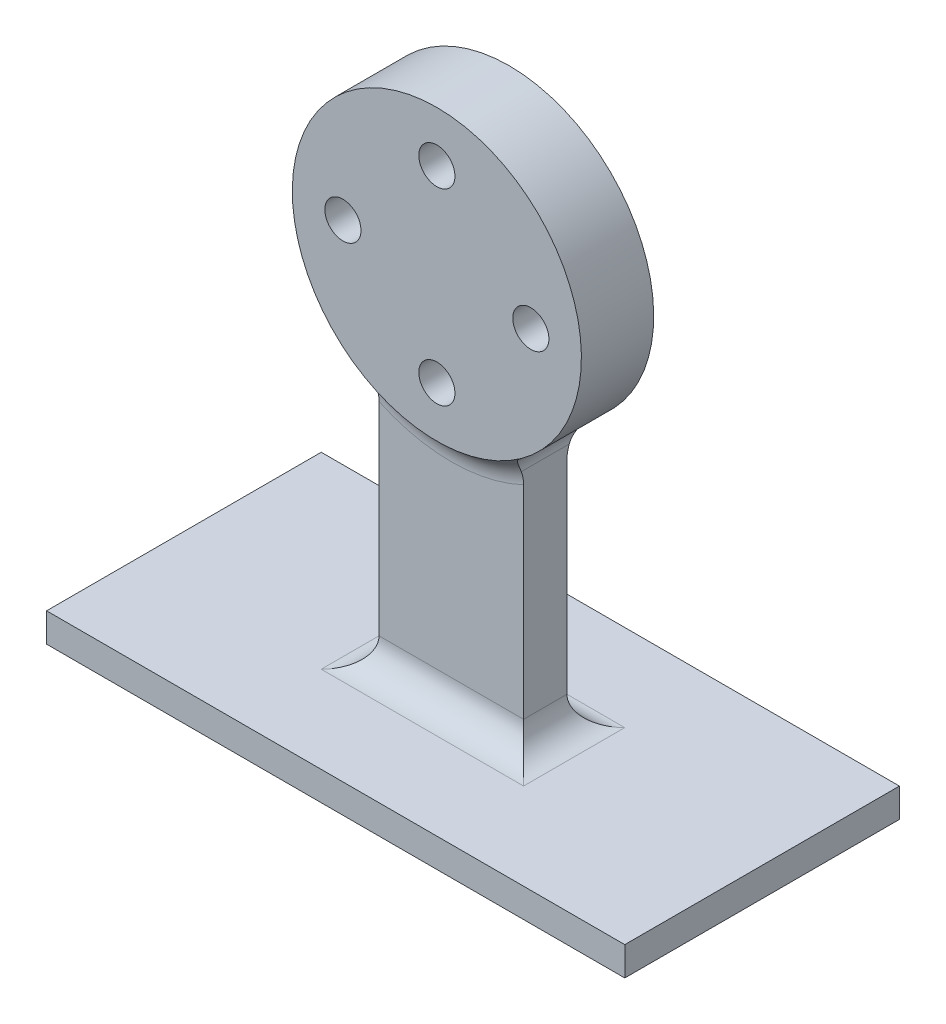
ISO-10303-21;
HEADER;
FILE_DESCRIPTION(('STEP AP214'),'2;1');
FILE_NAME('part.step','',(''),(''),'','','');
FILE_SCHEMA(('AUTOMOTIVE_DESIGN { 1 0 10303 214 1 1 1 1 }'));
ENDSEC;
DATA;
#1=APPLICATION_CONTEXT('core data for automotive mechanical design processes');
#2=APPLICATION_PROTOCOL_DEFINITION('international standard','automotive_design',2000,#1);
#3=PRODUCT_CONTEXT('',#1,'mechanical');
#4=PRODUCT('Part','Part','',(#3));
#5=PRODUCT_RELATED_PRODUCT_CATEGORY('part','',(#4));
#6=PRODUCT_DEFINITION_FORMATION('','',#4);
#7=PRODUCT_DEFINITION_CONTEXT('part definition',#1,'design');
#8=PRODUCT_DEFINITION('design','',#6,#7);
#9=PRODUCT_DEFINITION_SHAPE('','',#8);
#10=(LENGTH_UNIT() NAMED_UNIT(*) SI_UNIT(.MILLI.,.METRE.));
#11=(NAMED_UNIT(*) PLANE_ANGLE_UNIT() SI_UNIT($,.RADIAN.));
#12=(NAMED_UNIT(*) SI_UNIT($,.STERADIAN.) SOLID_ANGLE_UNIT());
#13=UNCERTAINTY_MEASURE_WITH_UNIT(LENGTH_MEASURE(1.E-05),#10,'distance_accuracy_value','');
#14=(GEOMETRIC_REPRESENTATION_CONTEXT(3) GLOBAL_UNCERTAINTY_ASSIGNED_CONTEXT((#13)) GLOBAL_UNIT_ASSIGNED_CONTEXT((#10,
#11,#12)) REPRESENTATION_CONTEXT('',''));
#15=CARTESIAN_POINT('',(0.,0.,0.));
#16=DIRECTION('',(0.,0.,1.));
#17=DIRECTION('',(1.,0.,0.));
#18=AXIS2_PLACEMENT_3D('',#15,#16,#17);
#19=CARTESIAN_POINT('',(0.,0.,5.));
#20=DIRECTION('',(0.,0.,-1.));
#21=DIRECTION('',(-1.,0.,0.));
#22=AXIS2_PLACEMENT_3D('',#19,#20,#21);
#23=CYLINDRICAL_SURFACE('',#22,10.);
#24=CARTESIAN_POINT('',(0.,0.,5.));
#25=DIRECTION('',(0.,0.,1.));
#26=DIRECTION('',(1.,0.,0.));
#27=AXIS2_PLACEMENT_3D('',#24,#25,#26);
#28=CIRCLE('',#27,10.);
#29=CARTESIAN_POINT('',(5.83333333333334,-8.12232862067414,5.));
#30=VERTEX_POINT('',#29);
#31=CARTESIAN_POINT('',(-5.83333333333334,-8.12232862067414,5.));
#32=VERTEX_POINT('',#31);
#33=EDGE_CURVE('E218',#30,#32,#28,.T.);
#34=ORIENTED_EDGE('',*,*,#33,.F.);
#35=DIRECTION('',(0.,0.,-1.));
#36=VECTOR('',#35,1.);
#37=CARTESIAN_POINT('',(5.83333333333334,-8.12232862067414,5.));
#38=LINE('',#37,#36);
#39=CARTESIAN_POINT('',(5.83333333333334,-8.12232862067414,0.));
#40=VERTEX_POINT('',#39);
#41=EDGE_CURVE('E249',#30,#40,#38,.T.);
#42=ORIENTED_EDGE('',*,*,#41,.T.);
#43=CARTESIAN_POINT('',(0.,0.,0.));
#44=DIRECTION('',(0.,0.,1.));
#45=DIRECTION('',(1.,0.,0.));
#46=AXIS2_PLACEMENT_3D('',#43,#44,#45);
#47=CIRCLE('',#46,10.);
#48=CARTESIAN_POINT('',(-5.83333333333334,-8.12232862067414,0.));
#49=VERTEX_POINT('',#48);
#50=EDGE_CURVE('E194',#40,#49,#47,.T.);
#51=ORIENTED_EDGE('',*,*,#50,.T.);
#52=DIRECTION('',(0.,0.,-1.));
#53=VECTOR('',#52,1.);
#54=CARTESIAN_POINT('',(-5.83333333333334,-8.12232862067414,5.));
#55=LINE('',#54,#53);
#56=EDGE_CURVE('E247',#49,#32,#55,.F.);
#57=ORIENTED_EDGE('',*,*,#56,.T.);
#58=EDGE_LOOP('',(#34,#42,#51,#57));
#59=FACE_BOUND('',#58,.T.);
#60=ADVANCED_FACE('F37',(#59),#23,.T.);
#61=CARTESIAN_POINT('',(0.,0.,5.));
#62=DIRECTION('',(0.,0.,1.));
#63=DIRECTION('',(1.,0.,0.));
#64=AXIS2_PLACEMENT_3D('',#61,#62,#63);
#65=PLANE('',#64);
#66=CARTESIAN_POINT('',(0.,6.5,5.));
#67=DIRECTION('',(0.,0.,1.));
#68=DIRECTION('',(1.,0.,0.));
#69=AXIS2_PLACEMENT_3D('',#66,#67,#68);
#70=CIRCLE('',#69,1.25);
#71=CARTESIAN_POINT('',(1.25,6.5,5.));
#72=VERTEX_POINT('',#71);
#73=EDGE_CURVE('E195',#72,#72,#70,.T.);
#74=ORIENTED_EDGE('',*,*,#73,.F.);
#75=EDGE_LOOP('',(#74));
#76=FACE_BOUND('',#75,.T.);
#77=CARTESIAN_POINT('',(6.5,0.,5.));
#78=DIRECTION('',(0.,0.,1.));
#79=DIRECTION('',(1.,0.,0.));
#80=AXIS2_PLACEMENT_3D('',#77,#78,#79);
#81=CIRCLE('',#80,1.25);
#82=CARTESIAN_POINT('',(7.75,0.,5.));
#83=VERTEX_POINT('',#82);
#84=EDGE_CURVE('E198',#83,#83,#81,.T.);
#85=ORIENTED_EDGE('',*,*,#84,.F.);
#86=EDGE_LOOP('',(#85));
#87=FACE_BOUND('',#86,.T.);
#88=CARTESIAN_POINT('',(0.,-6.5,5.));
#89=DIRECTION('',(0.,0.,1.));
#90=DIRECTION('',(1.,0.,0.));
#91=AXIS2_PLACEMENT_3D('',#88,#89,#90);
#92=CIRCLE('',#91,1.25);
#93=CARTESIAN_POINT('',(1.25,-6.5,5.));
#94=VERTEX_POINT('',#93);
#95=EDGE_CURVE('E204',#94,#94,#92,.T.);
#96=ORIENTED_EDGE('',*,*,#95,.F.);
#97=EDGE_LOOP('',(#96));
#98=FACE_BOUND('',#97,.T.);
#99=CARTESIAN_POINT('',(-6.5,0.,5.));
#100=DIRECTION('',(0.,0.,1.));
#101=DIRECTION('',(1.,0.,0.));
#102=AXIS2_PLACEMENT_3D('',#99,#100,#101);
#103=CIRCLE('',#102,1.25);
#104=CARTESIAN_POINT('',(-5.25,0.,5.));
#105=VERTEX_POINT('',#104);
#106=EDGE_CURVE('E210',#105,#105,#103,.T.);
#107=ORIENTED_EDGE('',*,*,#106,.F.);
#108=EDGE_LOOP('',(#107));
#109=FACE_BOUND('',#108,.T.);
#110=EDGE_CURVE('E215',#32,#30,#28,.T.);
#111=ORIENTED_EDGE('',*,*,#110,.T.);
#112=ORIENTED_EDGE('',*,*,#33,.T.);
#113=EDGE_LOOP('',(#111,#112));
#114=FACE_BOUND('',#113,.T.);
#115=ADVANCED_FACE('F391',(#76,#87,#98,#109,#114),#65,.T.);
#116=CARTESIAN_POINT('',(0.,0.,0.));
#117=DIRECTION('',(0.,0.,1.));
#118=DIRECTION('',(1.,0.,0.));
#119=AXIS2_PLACEMENT_3D('',#116,#117,#118);
#120=PLANE('',#119);
#121=CARTESIAN_POINT('',(0.,0.,0.));
#122=DIRECTION('',(0.,0.,-1.));
#123=DIRECTION('',(-1.,0.,0.));
#124=AXIS2_PLACEMENT_3D('',#121,#122,#123);
#125=CIRCLE('',#124,2.5);
#126=CARTESIAN_POINT('',(-2.5,0.,0.));
#127=VERTEX_POINT('',#126);
#128=EDGE_CURVE('E184',#127,#127,#125,.T.);
#129=ORIENTED_EDGE('',*,*,#128,.F.);
#130=EDGE_LOOP('',(#129));
#131=FACE_BOUND('',#130,.T.);
#132=CARTESIAN_POINT('',(0.,6.5,0.));
#133=DIRECTION('',(0.,0.,1.));
#134=DIRECTION('',(1.,0.,0.));
#135=AXIS2_PLACEMENT_3D('',#132,#133,#134);
#136=CIRCLE('',#135,1.25);
#137=CARTESIAN_POINT('',(1.25,6.5,0.));
#138=VERTEX_POINT('',#137);
#139=EDGE_CURVE('E191',#138,#138,#136,.T.);
#140=ORIENTED_EDGE('',*,*,#139,.T.);
#141=EDGE_LOOP('',(#140));
#142=FACE_BOUND('',#141,.T.);
#143=CARTESIAN_POINT('',(6.5,0.,0.));
#144=DIRECTION('',(0.,0.,1.));
#145=DIRECTION('',(1.,0.,0.));
#146=AXIS2_PLACEMENT_3D('',#143,#144,#145);
#147=CIRCLE('',#146,1.25);
#148=CARTESIAN_POINT('',(7.75,0.,0.));
#149=VERTEX_POINT('',#148);
#150=EDGE_CURVE('E201',#149,#149,#147,.T.);
#151=ORIENTED_EDGE('',*,*,#150,.T.);
#152=EDGE_LOOP('',(#151));
#153=FACE_BOUND('',#152,.T.);
#154=CARTESIAN_POINT('',(0.,-6.5,0.));
#155=DIRECTION('',(0.,0.,1.));
#156=DIRECTION('',(1.,0.,0.));
#157=AXIS2_PLACEMENT_3D('',#154,#155,#156);
#158=CIRCLE('',#157,1.25);
#159=CARTESIAN_POINT('',(1.25,-6.5,0.));
#160=VERTEX_POINT('',#159);
#161=EDGE_CURVE('E207',#160,#160,#158,.T.);
#162=ORIENTED_EDGE('',*,*,#161,.T.);
#163=EDGE_LOOP('',(#162));
#164=FACE_BOUND('',#163,.T.);
#165=CARTESIAN_POINT('',(-6.5,0.,0.));
#166=DIRECTION('',(0.,0.,1.));
#167=DIRECTION('',(1.,0.,0.));
#168=AXIS2_PLACEMENT_3D('',#165,#166,#167);
#169=CIRCLE('',#168,1.25);
#170=CARTESIAN_POINT('',(-5.25,0.,0.));
#171=VERTEX_POINT('',#170);
#172=EDGE_CURVE('E188',#171,#171,#169,.T.);
#173=ORIENTED_EDGE('',*,*,#172,.T.);
#174=EDGE_LOOP('',(#173));
#175=FACE_BOUND('',#174,.T.);
#176=EDGE_CURVE('E219',#49,#40,#47,.T.);
#177=ORIENTED_EDGE('',*,*,#176,.F.);
#178=ORIENTED_EDGE('',*,*,#50,.F.);
#179=EDGE_LOOP('',(#177,#178));
#180=FACE_BOUND('',#179,.T.);
#181=ADVANCED_FACE('F397',(#131,#142,#153,#164,#175,#180),#120,.F.);
#182=CARTESIAN_POINT('',(-6.5,0.,0.));
#183=DIRECTION('',(0.,0.,1.));
#184=DIRECTION('',(1.,0.,0.));
#185=AXIS2_PLACEMENT_3D('',#182,#183,#184);
#186=CYLINDRICAL_SURFACE('',#185,1.25);
#187=ORIENTED_EDGE('',*,*,#172,.F.);
#188=EDGE_LOOP('',(#187));
#189=FACE_BOUND('',#188,.T.);
#190=ORIENTED_EDGE('',*,*,#106,.T.);
#191=EDGE_LOOP('',(#190));
#192=FACE_BOUND('',#191,.T.);
#193=ADVANCED_FACE('F429',(#189,#192),#186,.F.);
#194=CARTESIAN_POINT('',(0.,-6.5,0.));
#195=DIRECTION('',(0.,0.,1.));
#196=DIRECTION('',(1.,0.,0.));
#197=AXIS2_PLACEMENT_3D('',#194,#195,#196);
#198=CYLINDRICAL_SURFACE('',#197,1.25);
#199=ORIENTED_EDGE('',*,*,#161,.F.);
#200=EDGE_LOOP('',(#199));
#201=FACE_BOUND('',#200,.T.);
#202=ORIENTED_EDGE('',*,*,#95,.T.);
#203=EDGE_LOOP('',(#202));
#204=FACE_BOUND('',#203,.T.);
#205=ADVANCED_FACE('F434',(#201,#204),#198,.F.);
#206=CARTESIAN_POINT('',(6.5,0.,0.));
#207=DIRECTION('',(0.,0.,1.));
#208=DIRECTION('',(1.,0.,0.));
#209=AXIS2_PLACEMENT_3D('',#206,#207,#208);
#210=CYLINDRICAL_SURFACE('',#209,1.25);
#211=ORIENTED_EDGE('',*,*,#150,.F.);
#212=EDGE_LOOP('',(#211));
#213=FACE_BOUND('',#212,.T.);
#214=ORIENTED_EDGE('',*,*,#84,.T.);
#215=EDGE_LOOP('',(#214));
#216=FACE_BOUND('',#215,.T.);
#217=ADVANCED_FACE('F620',(#213,#216),#210,.F.);
#218=CARTESIAN_POINT('',(0.,6.5,0.));
#219=DIRECTION('',(0.,0.,1.));
#220=DIRECTION('',(1.,0.,0.));
#221=AXIS2_PLACEMENT_3D('',#218,#219,#220);
#222=CYLINDRICAL_SURFACE('',#221,1.25);
#223=ORIENTED_EDGE('',*,*,#139,.F.);
#224=EDGE_LOOP('',(#223));
#225=FACE_BOUND('',#224,.T.);
#226=ORIENTED_EDGE('',*,*,#73,.T.);
#227=EDGE_LOOP('',(#226));
#228=FACE_BOUND('',#227,.T.);
#229=ADVANCED_FACE('F610',(#225,#228),#222,.F.);
#230=CARTESIAN_POINT('',(0.,0.,2.));
#231=DIRECTION('',(0.,0.,-1.));
#232=DIRECTION('',(-1.,0.,0.));
#233=AXIS2_PLACEMENT_3D('',#230,#231,#232);
#234=CYLINDRICAL_SURFACE('',#233,2.5);
#235=CARTESIAN_POINT('',(0.,0.,2.));
#236=DIRECTION('',(0.,0.,-1.));
#237=DIRECTION('',(-1.,0.,0.));
#238=AXIS2_PLACEMENT_3D('',#235,#236,#237);
#239=CIRCLE('',#238,2.5);
#240=CARTESIAN_POINT('',(-2.5,0.,2.));
#241=VERTEX_POINT('',#240);
#242=EDGE_CURVE('E185',#241,#241,#239,.T.);
#243=ORIENTED_EDGE('',*,*,#242,.F.);
#244=EDGE_LOOP('',(#243));
#245=FACE_BOUND('',#244,.T.);
#246=ORIENTED_EDGE('',*,*,#128,.T.);
#247=EDGE_LOOP('',(#246));
#248=FACE_BOUND('',#247,.T.);
#249=ADVANCED_FACE('F600',(#245,#248),#234,.F.);
#250=CARTESIAN_POINT('',(0.,0.,2.));
#251=DIRECTION('',(0.,0.,-1.));
#252=DIRECTION('',(-1.,0.,0.));
#253=AXIS2_PLACEMENT_3D('',#250,#251,#252);
#254=PLANE('',#253);
#255=ORIENTED_EDGE('',*,*,#242,.T.);
#256=EDGE_LOOP('',(#255));
#257=FACE_BOUND('',#256,.T.);
#258=ADVANCED_FACE('F277',(#257),#254,.T.);
#259=CARTESIAN_POINT('',(5.,-26.6602540378444,1.));
#260=DIRECTION('',(1.,0.,0.));
#261=DIRECTION('',(0.,1.,0.));
#262=AXIS2_PLACEMENT_3D('',#259,#260,#261);
#263=PLANE('',#262);
#264=DIRECTION('',(0.,1.,0.));
#265=VECTOR('',#264,1.);
#266=CARTESIAN_POINT('',(5.,-26.6602540378444,4.));
#267=LINE('',#266,#265);
#268=CARTESIAN_POINT('',(5.,-24.6602540378444,4.));
#269=VERTEX_POINT('',#268);
#270=CARTESIAN_POINT('',(5.,-10.6132472010868,4.));
#271=VERTEX_POINT('',#270);
#272=EDGE_CURVE('E170',#269,#271,#267,.T.);
#273=ORIENTED_EDGE('',*,*,#272,.F.);
#274=DIRECTION('',(0.,0.,1.));
#275=VECTOR('',#274,1.);
#276=CARTESIAN_POINT('',(5.,-24.6602540378444,1.));
#277=LINE('',#276,#275);
#278=CARTESIAN_POINT('',(5.,-24.6602540378444,1.));
#279=VERTEX_POINT('',#278);
#280=EDGE_CURVE('E245',#269,#279,#277,.F.);
#281=ORIENTED_EDGE('',*,*,#280,.T.);
#282=DIRECTION('',(0.,1.,0.));
#283=VECTOR('',#282,1.);
#284=CARTESIAN_POINT('',(5.,-26.6602540378444,1.));
#285=LINE('',#284,#283);
#286=CARTESIAN_POINT('',(5.,-10.6132472010868,1.));
#287=VERTEX_POINT('',#286);
#288=EDGE_CURVE('E181',#279,#287,#285,.T.);
#289=ORIENTED_EDGE('',*,*,#288,.T.);
#290=CARTESIAN_POINT('',(5.,-10.6132472010868,1.));
#291=CARTESIAN_POINT('',(5.,-10.5391635665936,1.00000288514886));
#292=CARTESIAN_POINT('',(5.,-10.4650857480454,0.996631428996122));
#293=CARTESIAN_POINT('',(5.,-10.3181205488007,0.983294126606835));
#294=CARTESIAN_POINT('',(5.,-10.2452283858777,0.973381003851979));
#295=CARTESIAN_POINT('',(5.,-10.1006246438172,0.947112877125106));
#296=CARTESIAN_POINT('',(5.,-10.0289129052303,0.93075875075485));
#297=CARTESIAN_POINT('',(5.,-9.88666342770013,0.891569529636029));
#298=CARTESIAN_POINT('',(5.,-9.81613972978939,0.868683474575391));
#299=CARTESIAN_POINT('',(5.,-9.74679434480896,0.842644505244962));
#300=B_SPLINE_CURVE_WITH_KNOTS('',3,(#290,#291,#292,#293,#294,#295,#296,#297,#298,#299),
.UNSPECIFIED.,.F.,.F.,(4,2,2,2,4),(0.,0.2221658438168,0.442562628755395,0.662929394501195,
0.885064736673274),.UNSPECIFIED.);
#301=CARTESIAN_POINT('',(5.,-9.74679434480896,0.842644505244962));
#302=VERTEX_POINT('',#301);
#303=EDGE_CURVE('E259',#287,#302,#300,.T.);
#304=ORIENTED_EDGE('',*,*,#303,.T.);
#305=DIRECTION('',(0.,0.,-1.));
#306=VECTOR('',#305,1.);
#307=CARTESIAN_POINT('',(5.,-9.74679434480896,1.));
#308=LINE('',#307,#306);
#309=CARTESIAN_POINT('',(5.,-9.74679434480896,4.15735549475504));
#310=VERTEX_POINT('',#309);
#311=EDGE_CURVE('E243',#302,#310,#308,.F.);
#312=ORIENTED_EDGE('',*,*,#311,.T.);
#313=CARTESIAN_POINT('',(5.,-9.74679434480896,4.15735549475504));
#314=CARTESIAN_POINT('',(5.,-9.81613972978939,4.13131652542461));
#315=CARTESIAN_POINT('',(5.,-9.88666342770013,4.10843047036397));
#316=CARTESIAN_POINT('',(5.,-10.0289129052303,4.06924124924515));
#317=CARTESIAN_POINT('',(5.,-10.1006246438172,4.05288712287489));
#318=CARTESIAN_POINT('',(5.,-10.2452283858777,4.02661899614802));
#319=CARTESIAN_POINT('',(5.,-10.3181205488007,4.01670587339317));
#320=CARTESIAN_POINT('',(5.,-10.4650857480454,4.00336857100388));
#321=CARTESIAN_POINT('',(5.,-10.5391635665936,3.99999711485114));
#322=CARTESIAN_POINT('',(5.,-10.6132472010868,4.));
#323=B_SPLINE_CURVE_WITH_KNOTS('',3,(#313,#314,#315,#316,#317,#318,#319,#320,#321,#322),
.UNSPECIFIED.,.F.,.F.,(4,2,2,2,4),(0.,0.222135342172082,0.442502107917879,0.662898892856473,
0.885064736673272),.UNSPECIFIED.);
#324=EDGE_CURVE('E11',#310,#271,#323,.T.);
#325=ORIENTED_EDGE('',*,*,#324,.T.);
#326=EDGE_LOOP('',(#273,#281,#289,#304,#312,#325));
#327=FACE_BOUND('',#326,.T.);
#328=ADVANCED_FACE('F274',(#327),#263,.T.);
#329=CARTESIAN_POINT('',(-5.,-8.66025403784439,1.));
#330=DIRECTION('',(-1.,0.,0.));
#331=DIRECTION('',(0.,-1.,0.));
#332=AXIS2_PLACEMENT_3D('',#329,#330,#331);
#333=PLANE('',#332);
#334=DIRECTION('',(0.,-1.,0.));
#335=VECTOR('',#334,1.);
#336=CARTESIAN_POINT('',(-5.,-8.66025403784439,1.));
#337=LINE('',#336,#335);
#338=CARTESIAN_POINT('',(-5.,-10.6132472010868,1.));
#339=VERTEX_POINT('',#338);
#340=CARTESIAN_POINT('',(-5.,-24.6602540378444,1.));
#341=VERTEX_POINT('',#340);
#342=EDGE_CURVE('E178',#339,#341,#337,.T.);
#343=ORIENTED_EDGE('',*,*,#342,.T.);
#344=DIRECTION('',(0.,0.,1.));
#345=VECTOR('',#344,1.);
#346=CARTESIAN_POINT('',(-5.,-24.6602540378444,1.));
#347=LINE('',#346,#345);
#348=CARTESIAN_POINT('',(-5.,-24.6602540378444,4.));
#349=VERTEX_POINT('',#348);
#350=EDGE_CURVE('E223',#341,#349,#347,.T.);
#351=ORIENTED_EDGE('',*,*,#350,.T.);
#352=DIRECTION('',(0.,-1.,0.));
#353=VECTOR('',#352,1.);
#354=CARTESIAN_POINT('',(-5.,-8.66025403784439,4.));
#355=LINE('',#354,#353);
#356=CARTESIAN_POINT('',(-5.,-10.6132472010868,4.));
#357=VERTEX_POINT('',#356);
#358=EDGE_CURVE('E167',#357,#349,#355,.T.);
#359=ORIENTED_EDGE('',*,*,#358,.F.);
#360=CARTESIAN_POINT('',(-5.,-10.6132472010868,4.));
#361=CARTESIAN_POINT('',(-5.,-10.5391635665936,3.99999711485114));
#362=CARTESIAN_POINT('',(-5.,-10.4650857480454,4.00336857100388));
#363=CARTESIAN_POINT('',(-5.,-10.3181205488007,4.01670587339317));
#364=CARTESIAN_POINT('',(-5.,-10.2452283858777,4.02661899614802));
#365=CARTESIAN_POINT('',(-5.,-10.1006246438172,4.05288712287489));
#366=CARTESIAN_POINT('',(-5.,-10.0289129052303,4.06924124924515));
#367=CARTESIAN_POINT('',(-5.,-9.88666342770013,4.10843047036397));
#368=CARTESIAN_POINT('',(-5.,-9.81613972978939,4.13131652542461));
#369=CARTESIAN_POINT('',(-5.,-9.74679434480896,4.15735549475504));
#370=B_SPLINE_CURVE_WITH_KNOTS('',3,(#360,#361,#362,#363,#364,#365,#366,#367,#368,#369),
.UNSPECIFIED.,.F.,.F.,(4,2,2,2,4),(0.,0.222165843816801,0.442562628755395,0.662929394501191,
0.885064736673272),.UNSPECIFIED.);
#371=CARTESIAN_POINT('',(-5.,-9.74679434480896,4.15735549475504));
#372=VERTEX_POINT('',#371);
#373=EDGE_CURVE('E51',#357,#372,#370,.T.);
#374=ORIENTED_EDGE('',*,*,#373,.T.);
#375=DIRECTION('',(0.,0.,-1.));
#376=VECTOR('',#375,1.);
#377=CARTESIAN_POINT('',(-5.,-9.74679434480896,1.));
#378=LINE('',#377,#376);
#379=CARTESIAN_POINT('',(-5.,-9.74679434480896,0.842644505244963));
#380=VERTEX_POINT('',#379);
#381=EDGE_CURVE('E59',#372,#380,#378,.T.);
#382=ORIENTED_EDGE('',*,*,#381,.T.);
#383=CARTESIAN_POINT('',(-5.,-9.74679434480896,0.842644505244963));
#384=CARTESIAN_POINT('',(-5.,-9.81613972978939,0.868683474575392));
#385=CARTESIAN_POINT('',(-5.,-9.88666342770013,0.89156952963603));
#386=CARTESIAN_POINT('',(-5.,-10.0289129052303,0.930758750754851));
#387=CARTESIAN_POINT('',(-5.,-10.1006246438172,0.947112877125106));
#388=CARTESIAN_POINT('',(-5.,-10.2452283858777,0.973381003851979));
#389=CARTESIAN_POINT('',(-5.,-10.3181205488007,0.983294126606834));
#390=CARTESIAN_POINT('',(-5.,-10.4650857480454,0.996631428996122));
#391=CARTESIAN_POINT('',(-5.,-10.5391635665936,1.00000288514886));
#392=CARTESIAN_POINT('',(-5.,-10.6132472010868,1.));
#393=B_SPLINE_CURVE_WITH_KNOTS('',3,(#383,#384,#385,#386,#387,#388,#389,#390,#391,#392),
.UNSPECIFIED.,.F.,.F.,(4,2,2,2,4),(0.,0.22213534217208,0.442502107917877,0.662898892856471,
0.88506473667327),.UNSPECIFIED.);
#394=EDGE_CURVE('E252',#380,#339,#393,.T.);
#395=ORIENTED_EDGE('',*,*,#394,.T.);
#396=EDGE_LOOP('',(#343,#351,#359,#374,#382,#395));
#397=FACE_BOUND('',#396,.T.);
#398=ADVANCED_FACE('F269',(#397),#333,.T.);
#399=CARTESIAN_POINT('',(0.,0.,1.));
#400=DIRECTION('',(0.,0.,1.));
#401=DIRECTION('',(1.,0.,0.));
#402=AXIS2_PLACEMENT_3D('',#399,#400,#401);
#403=PLANE('',#402);
#404=ORIENTED_EDGE('',*,*,#288,.F.);
#405=DIRECTION('',(1.,0.,0.));
#406=VECTOR('',#405,1.);
#407=CARTESIAN_POINT('',(-5.,-24.6602540378444,1.));
#408=LINE('',#407,#406);
#409=EDGE_CURVE('E237',#279,#341,#408,.F.);
#410=ORIENTED_EDGE('',*,*,#409,.T.);
#411=ORIENTED_EDGE('',*,*,#342,.F.);
#412=CARTESIAN_POINT('',(0.,0.,1.));
#413=DIRECTION('',(0.,0.,1.));
#414=DIRECTION('',(1.,0.,0.));
#415=AXIS2_PLACEMENT_3D('',#412,#413,#414);
#416=CIRCLE('',#415,11.7320508075689);
#417=EDGE_CURVE('E235',#339,#287,#416,.T.);
#418=ORIENTED_EDGE('',*,*,#417,.T.);
#419=EDGE_LOOP('',(#404,#410,#411,#418));
#420=FACE_BOUND('',#419,.T.);
#421=ADVANCED_FACE('F273',(#420),#403,.F.);
#422=CARTESIAN_POINT('',(0.,0.,4.));
#423=DIRECTION('',(0.,0.,1.));
#424=DIRECTION('',(1.,0.,0.));
#425=AXIS2_PLACEMENT_3D('',#422,#423,#424);
#426=PLANE('',#425);
#427=ORIENTED_EDGE('',*,*,#358,.T.);
#428=DIRECTION('',(1.,0.,0.));
#429=VECTOR('',#428,1.);
#430=CARTESIAN_POINT('',(0.,-24.6602540378444,4.));
#431=LINE('',#430,#429);
#432=EDGE_CURVE('E241',#349,#269,#431,.T.);
#433=ORIENTED_EDGE('',*,*,#432,.T.);
#434=ORIENTED_EDGE('',*,*,#272,.T.);
#435=CARTESIAN_POINT('',(0.,0.,4.));
#436=DIRECTION('',(0.,0.,1.));
#437=DIRECTION('',(1.,0.,0.));
#438=AXIS2_PLACEMENT_3D('',#435,#436,#437);
#439=CIRCLE('',#438,11.7320508075689);
#440=EDGE_CURVE('E239',#271,#357,#439,.F.);
#441=ORIENTED_EDGE('',*,*,#440,.T.);
#442=EDGE_LOOP('',(#427,#433,#434,#441));
#443=FACE_BOUND('',#442,.T.);
#444=ADVANCED_FACE('F335',(#443),#426,.T.);
#445=CARTESIAN_POINT('',(0.,-26.6602540378444,0.));
#446=DIRECTION('',(0.,-1.,0.));
#447=DIRECTION('',(0.,0.,-1.));
#448=AXIS2_PLACEMENT_3D('',#445,#446,#447);
#449=PLANE('',#448);
#450=DIRECTION('',(1.,0.,0.));
#451=VECTOR('',#450,1.);
#452=CARTESIAN_POINT('',(0.,-26.6602540378444,6.));
#453=LINE('',#452,#451);
#454=CARTESIAN_POINT('',(7.,-26.6602540378444,6.));
#455=VERTEX_POINT('',#454);
#456=CARTESIAN_POINT('',(-7.,-26.6602540378444,6.));
#457=VERTEX_POINT('',#456);
#458=EDGE_CURVE('E228',#455,#457,#453,.F.);
#459=ORIENTED_EDGE('',*,*,#458,.T.);
#460=DIRECTION('',(0.,0.,1.));
#461=VECTOR('',#460,1.);
#462=CARTESIAN_POINT('',(-7.,-26.6602540378444,0.));
#463=LINE('',#462,#461);
#464=CARTESIAN_POINT('',(-7.,-26.6602540378444,-1.));
#465=VERTEX_POINT('',#464);
#466=EDGE_CURVE('E232',#457,#465,#463,.F.);
#467=ORIENTED_EDGE('',*,*,#466,.T.);
#468=DIRECTION('',(1.,0.,0.));
#469=VECTOR('',#468,1.);
#470=CARTESIAN_POINT('',(5.,-26.6602540378444,-1.));
#471=LINE('',#470,#469);
#472=CARTESIAN_POINT('',(7.,-26.6602540378444,-1.));
#473=VERTEX_POINT('',#472);
#474=EDGE_CURVE('E230',#465,#473,#471,.T.);
#475=ORIENTED_EDGE('',*,*,#474,.T.);
#476=DIRECTION('',(0.,0.,1.));
#477=VECTOR('',#476,1.);
#478=CARTESIAN_POINT('',(7.,-26.6602540378444,0.));
#479=LINE('',#478,#477);
#480=EDGE_CURVE('E226',#473,#455,#479,.T.);
#481=ORIENTED_EDGE('',*,*,#480,.T.);
#482=EDGE_LOOP('',(#459,#467,#475,#481));
#483=FACE_BOUND('',#482,.T.);
#484=DIRECTION('',(0.,0.,1.));
#485=VECTOR('',#484,1.);
#486=CARTESIAN_POINT('',(20.,-26.6602540378444,12.));
#487=LINE('',#486,#485);
#488=CARTESIAN_POINT('',(20.,-26.6602540378444,-7.));
#489=VERTEX_POINT('',#488);
#490=CARTESIAN_POINT('',(20.,-26.6602540378444,12.));
#491=VERTEX_POINT('',#490);
#492=EDGE_CURVE('E166',#489,#491,#487,.T.);
#493=ORIENTED_EDGE('',*,*,#492,.F.);
#494=DIRECTION('',(1.,0.,0.));
#495=VECTOR('',#494,1.);
#496=CARTESIAN_POINT('',(-20.,-26.6602540378444,-7.));
#497=LINE('',#496,#495);
#498=CARTESIAN_POINT('',(-20.,-26.6602540378444,-7.));
#499=VERTEX_POINT('',#498);
#500=EDGE_CURVE('E162',#499,#489,#497,.T.);
#501=ORIENTED_EDGE('',*,*,#500,.F.);
#502=DIRECTION('',(0.,0.,-1.));
#503=VECTOR('',#502,1.);
#504=CARTESIAN_POINT('',(-20.,-26.6602540378444,12.));
#505=LINE('',#504,#503);
#506=CARTESIAN_POINT('',(-20.,-26.6602540378444,12.));
#507=VERTEX_POINT('',#506);
#508=EDGE_CURVE('E364',#507,#499,#505,.T.);
#509=ORIENTED_EDGE('',*,*,#508,.F.);
#510=DIRECTION('',(-1.,0.,0.));
#511=VECTOR('',#510,1.);
#512=CARTESIAN_POINT('',(-20.,-26.6602540378444,12.));
#513=LINE('',#512,#511);
#514=EDGE_CURVE('E362',#491,#507,#513,.T.);
#515=ORIENTED_EDGE('',*,*,#514,.F.);
#516=EDGE_LOOP('',(#493,#501,#509,#515));
#517=FACE_BOUND('',#516,.T.);
#518=ADVANCED_FACE('F380',(#483,#517),#449,.F.);
#519=CARTESIAN_POINT('',(20.,-28.6602540378444,12.));
#520=DIRECTION('',(-1.,0.,0.));
#521=DIRECTION('',(0.,0.,1.));
#522=AXIS2_PLACEMENT_3D('',#519,#520,#521);
#523=PLANE('',#522);
#524=ORIENTED_EDGE('',*,*,#492,.T.);
#525=DIRECTION('',(0.,1.,0.));
#526=VECTOR('',#525,1.);
#527=CARTESIAN_POINT('',(20.,-28.6602540378444,12.));
#528=LINE('',#527,#526);
#529=CARTESIAN_POINT('',(20.,-28.6602540378444,12.));
#530=VERTEX_POINT('',#529);
#531=EDGE_CURVE('E146',#530,#491,#528,.T.);
#532=ORIENTED_EDGE('',*,*,#531,.F.);
#533=DIRECTION('',(0.,0.,1.));
#534=VECTOR('',#533,1.);
#535=CARTESIAN_POINT('',(20.,-28.6602540378444,12.));
#536=LINE('',#535,#534);
#537=CARTESIAN_POINT('',(20.,-28.6602540378444,-7.));
#538=VERTEX_POINT('',#537);
#539=EDGE_CURVE('E153',#538,#530,#536,.T.);
#540=ORIENTED_EDGE('',*,*,#539,.F.);
#541=DIRECTION('',(0.,1.,0.));
#542=VECTOR('',#541,1.);
#543=CARTESIAN_POINT('',(20.,-28.6602540378444,-7.));
#544=LINE('',#543,#542);
#545=EDGE_CURVE('E371',#538,#489,#544,.T.);
#546=ORIENTED_EDGE('',*,*,#545,.T.);
#547=EDGE_LOOP('',(#524,#532,#540,#546));
#548=FACE_BOUND('',#547,.T.);
#549=ADVANCED_FACE('F164',(#548),#523,.F.);
#550=CARTESIAN_POINT('',(-20.,-28.6602540378444,12.));
#551=DIRECTION('',(0.,0.,-1.));
#552=DIRECTION('',(-1.,0.,0.));
#553=AXIS2_PLACEMENT_3D('',#550,#551,#552);
#554=PLANE('',#553);
#555=ORIENTED_EDGE('',*,*,#514,.T.);
#556=DIRECTION('',(0.,1.,0.));
#557=VECTOR('',#556,1.);
#558=CARTESIAN_POINT('',(-20.,-28.6602540378444,12.));
#559=LINE('',#558,#557);
#560=CARTESIAN_POINT('',(-20.,-28.6602540378444,12.));
#561=VERTEX_POINT('',#560);
#562=EDGE_CURVE('E149',#561,#507,#559,.T.);
#563=ORIENTED_EDGE('',*,*,#562,.F.);
#564=DIRECTION('',(-1.,0.,0.));
#565=VECTOR('',#564,1.);
#566=CARTESIAN_POINT('',(-20.,-28.6602540378444,12.));
#567=LINE('',#566,#565);
#568=EDGE_CURVE('E142',#530,#561,#567,.T.);
#569=ORIENTED_EDGE('',*,*,#568,.F.);
#570=ORIENTED_EDGE('',*,*,#531,.T.);
#571=EDGE_LOOP('',(#555,#563,#569,#570));
#572=FACE_BOUND('',#571,.T.);
#573=ADVANCED_FACE('F144',(#572),#554,.F.);
#574=CARTESIAN_POINT('',(-20.,-28.6602540378444,12.));
#575=DIRECTION('',(1.,0.,0.));
#576=DIRECTION('',(0.,0.,-1.));
#577=AXIS2_PLACEMENT_3D('',#574,#575,#576);
#578=PLANE('',#577);
#579=ORIENTED_EDGE('',*,*,#508,.T.);
#580=DIRECTION('',(0.,1.,0.));
#581=VECTOR('',#580,1.);
#582=CARTESIAN_POINT('',(-20.,-28.6602540378444,-7.));
#583=LINE('',#582,#581);
#584=CARTESIAN_POINT('',(-20.,-28.6602540378444,-7.));
#585=VERTEX_POINT('',#584);
#586=EDGE_CURVE('E172',#585,#499,#583,.T.);
#587=ORIENTED_EDGE('',*,*,#586,.F.);
#588=DIRECTION('',(0.,0.,-1.));
#589=VECTOR('',#588,1.);
#590=CARTESIAN_POINT('',(-20.,-28.6602540378444,12.));
#591=LINE('',#590,#589);
#592=EDGE_CURVE('E152',#561,#585,#591,.T.);
#593=ORIENTED_EDGE('',*,*,#592,.F.);
#594=ORIENTED_EDGE('',*,*,#562,.T.);
#595=EDGE_LOOP('',(#579,#587,#593,#594));
#596=FACE_BOUND('',#595,.T.);
#597=ADVANCED_FACE('F381',(#596),#578,.F.);
#598=CARTESIAN_POINT('',(-20.,-28.6602540378444,-7.));
#599=DIRECTION('',(0.,0.,1.));
#600=DIRECTION('',(1.,0.,0.));
#601=AXIS2_PLACEMENT_3D('',#598,#599,#600);
#602=PLANE('',#601);
#603=ORIENTED_EDGE('',*,*,#500,.T.);
#604=ORIENTED_EDGE('',*,*,#545,.F.);
#605=DIRECTION('',(1.,0.,0.));
#606=VECTOR('',#605,1.);
#607=CARTESIAN_POINT('',(-20.,-28.6602540378444,-7.));
#608=LINE('',#607,#606);
#609=EDGE_CURVE('E158',#585,#538,#608,.T.);
#610=ORIENTED_EDGE('',*,*,#609,.F.);
#611=ORIENTED_EDGE('',*,*,#586,.T.);
#612=EDGE_LOOP('',(#603,#604,#610,#611));
#613=FACE_BOUND('',#612,.T.);
#614=ADVANCED_FACE('F376',(#613),#602,.F.);
#615=CARTESIAN_POINT('',(0.,-28.6602540378444,0.));
#616=DIRECTION('',(0.,-1.,0.));
#617=DIRECTION('',(0.,0.,-1.));
#618=AXIS2_PLACEMENT_3D('',#615,#616,#617);
#619=PLANE('',#618);
#620=ORIENTED_EDGE('',*,*,#539,.T.);
#621=ORIENTED_EDGE('',*,*,#568,.T.);
#622=ORIENTED_EDGE('',*,*,#592,.T.);
#623=ORIENTED_EDGE('',*,*,#609,.T.);
#624=EDGE_LOOP('',(#620,#621,#622,#623));
#625=FACE_BOUND('',#624,.T.);
#626=ADVANCED_FACE('F156',(#625),#619,.T.);
#627=CARTESIAN_POINT('',(7.,-24.6602540378444,0.));
#628=DIRECTION('',(0.,0.,1.));
#629=DIRECTION('',(1.,0.,0.));
#630=AXIS2_PLACEMENT_3D('',#627,#628,#629);
#631=CYLINDRICAL_SURFACE('',#630,2.);
#632=CARTESIAN_POINT('',(7.,-24.6602540378444,6.));
#633=DIRECTION('',(-0.707106781186547,0.,0.707106781186547));
#634=DIRECTION('',(0.707106781186547,0.,0.707106781186547));
#635=AXIS2_PLACEMENT_3D('',#632,#633,#634);
#636=ELLIPSE('',#635,2.82842712474619,2.);
#637=EDGE_CURVE('E345',#455,#269,#636,.F.);
#638=ORIENTED_EDGE('',*,*,#637,.F.);
#639=ORIENTED_EDGE('',*,*,#480,.F.);
#640=CARTESIAN_POINT('',(7.,-24.6602540378444,-1.));
#641=DIRECTION('',(0.707106781186547,0.,0.707106781186547));
#642=DIRECTION('',(-0.707106781186547,0.,0.707106781186547));
#643=AXIS2_PLACEMENT_3D('',#640,#641,#642);
#644=ELLIPSE('',#643,2.82842712474619,2.);
#645=EDGE_CURVE('E357',#279,#473,#644,.T.);
#646=ORIENTED_EDGE('',*,*,#645,.F.);
#647=ORIENTED_EDGE('',*,*,#280,.F.);
#648=EDGE_LOOP('',(#638,#639,#646,#647));
#649=FACE_BOUND('',#648,.T.);
#650=ADVANCED_FACE('F296',(#649),#631,.F.);
#651=CARTESIAN_POINT('',(0.,-24.6602540378444,-1.));
#652=DIRECTION('',(-1.,0.,0.));
#653=DIRECTION('',(0.,0.,1.));
#654=AXIS2_PLACEMENT_3D('',#651,#652,#653);
#655=CYLINDRICAL_SURFACE('',#654,2.);
#656=ORIENTED_EDGE('',*,*,#645,.T.);
#657=ORIENTED_EDGE('',*,*,#474,.F.);
#658=CARTESIAN_POINT('',(-7.,-24.6602540378444,-1.));
#659=DIRECTION('',(-0.707106781186547,0.,0.707106781186547));
#660=DIRECTION('',(-0.707106781186547,0.,-0.707106781186547));
#661=AXIS2_PLACEMENT_3D('',#658,#659,#660);
#662=ELLIPSE('',#661,2.82842712474619,2.);
#663=EDGE_CURVE('E352',#341,#465,#662,.F.);
#664=ORIENTED_EDGE('',*,*,#663,.F.);
#665=ORIENTED_EDGE('',*,*,#409,.F.);
#666=EDGE_LOOP('',(#656,#657,#664,#665));
#667=FACE_BOUND('',#666,.T.);
#668=ADVANCED_FACE('F405',(#667),#655,.F.);
#669=CARTESIAN_POINT('',(0.,-24.6602540378444,6.));
#670=DIRECTION('',(1.,0.,0.));
#671=DIRECTION('',(0.,0.,-1.));
#672=AXIS2_PLACEMENT_3D('',#669,#670,#671);
#673=CYLINDRICAL_SURFACE('',#672,2.);
#674=ORIENTED_EDGE('',*,*,#637,.T.);
#675=ORIENTED_EDGE('',*,*,#432,.F.);
#676=CARTESIAN_POINT('',(-7.,-24.6602540378444,6.));
#677=DIRECTION('',(0.707106781186547,0.,0.707106781186547));
#678=DIRECTION('',(0.707106781186547,0.,-0.707106781186547));
#679=AXIS2_PLACEMENT_3D('',#676,#677,#678);
#680=ELLIPSE('',#679,2.82842712474619,2.);
#681=EDGE_CURVE('E343',#457,#349,#680,.T.);
#682=ORIENTED_EDGE('',*,*,#681,.F.);
#683=ORIENTED_EDGE('',*,*,#458,.F.);
#684=EDGE_LOOP('',(#674,#675,#682,#683));
#685=FACE_BOUND('',#684,.T.);
#686=ADVANCED_FACE('F341',(#685),#673,.F.);
#687=CARTESIAN_POINT('',(-7.,-24.6602540378444,1.));
#688=DIRECTION('',(0.,0.,1.));
#689=DIRECTION('',(1.,0.,0.));
#690=AXIS2_PLACEMENT_3D('',#687,#688,#689);
#691=CYLINDRICAL_SURFACE('',#690,2.);
#692=ORIENTED_EDGE('',*,*,#663,.T.);
#693=ORIENTED_EDGE('',*,*,#466,.F.);
#694=ORIENTED_EDGE('',*,*,#681,.T.);
#695=ORIENTED_EDGE('',*,*,#350,.F.);
#696=EDGE_LOOP('',(#692,#693,#694,#695));
#697=FACE_BOUND('',#696,.T.);
#698=ADVANCED_FACE('F350',(#697),#691,.F.);
#699=CARTESIAN_POINT('',(-7.,-9.74679434480896,5.));
#700=DIRECTION('',(0.,0.,-1.));
#701=DIRECTION('',(-1.,0.,0.));
#702=AXIS2_PLACEMENT_3D('',#699,#700,#701);
#703=CYLINDRICAL_SURFACE('',#702,2.);
#704=CARTESIAN_POINT('',(-5.83333333333334,-8.12232862067414,5.));
#705=CARTESIAN_POINT('',(-5.80833214094154,-8.14027623690603,5.00002916695236));
#706=CARTESIAN_POINT('',(-5.78377920456711,-8.15879241052308,4.9985227521668));
#707=CARTESIAN_POINT('',(-5.73582185670773,-8.19670431920817,4.99269311549883));
#708=CARTESIAN_POINT('',(-5.71241428766726,-8.21609731509132,4.98837816868799));
#709=CARTESIAN_POINT('',(-5.64497385110064,-8.27458623994652,4.97180782804429));
#710=CARTESIAN_POINT('',(-5.60272019418985,-8.31471929400101,4.95590636063972));
#711=CARTESIAN_POINT('',(-5.53274614769675,-8.3869851397883,4.92186646158127));
#712=CARTESIAN_POINT('',(-5.50394102426512,-8.41878752077172,4.90512661660252));
#713=CARTESIAN_POINT('',(-5.44912805199853,-8.48323563008748,4.86887849310503));
#714=CARTESIAN_POINT('',(-5.42312186700225,-8.51588184589755,4.84936858371788));
#715=CARTESIAN_POINT('',(-5.34838022558215,-8.61579831325772,4.78767188297865));
#716=CARTESIAN_POINT('',(-5.30361323026767,-8.68431922531737,4.7427067478114));
#717=CARTESIAN_POINT('',(-5.23166407850251,-8.81027161929199,4.66019116354621));
#718=CARTESIAN_POINT('',(-5.2027621223984,-8.86702828255661,4.6230548089531));
#719=CARTESIAN_POINT('',(-5.15043473638082,-8.98314114925123,4.54885315199411));
#720=CARTESIAN_POINT('',(-5.12701270959708,-9.04249894100675,4.51178790788304));
#721=CARTESIAN_POINT('',(-5.08589673012395,-9.16347748754548,4.43927928079568));
#722=CARTESIAN_POINT('',(-5.06816174087571,-9.22507828600319,4.40382593942676));
#723=CARTESIAN_POINT('',(-5.03849777774556,-9.35095936899411,4.33534184880413));
#724=CARTESIAN_POINT('',(-5.02656568228192,-9.41523819267301,4.30230980518906));
#725=CARTESIAN_POINT('',(-5.01196494920771,-9.52403499361966,4.25036900074307));
#726=CARTESIAN_POINT('',(-5.00752642797235,-9.5678481196241,4.23047435930266));
#727=CARTESIAN_POINT('',(-5.0015411983702,-9.65655885600841,4.19247560138146));
#728=CARTESIAN_POINT('',(-5.00000143326747,-9.70145880998672,4.17437588208885));
#729=CARTESIAN_POINT('',(-5.,-9.74679434480896,4.15735549475504));
#730=B_SPLINE_CURVE_WITH_KNOTS('',3,(#704,#705,#706,#707,#708,#709,#710,#711,#712,#713,#714,
#715,#716,#717,#718,#719,#720,#721,#722,#723,#724,#725,#726,#727,#728,#729),.UNSPECIFIED.,.F.,
.F.,(4,2,2,2,2,2,2,2,2,2,2,2,4),(0.,0.0922280666535081,0.184185614762906,0.364449180936465,
0.502448511126049,0.640529427592858,0.919886504468669,1.14086674532767,1.36198385657762,
1.58146751971825,1.8008329838788,1.94567921208119,2.09087194487873),.UNSPECIFIED.);
#731=EDGE_CURVE('E310',#32,#372,#730,.T.);
#732=ORIENTED_EDGE('',*,*,#731,.F.);
#733=ORIENTED_EDGE('',*,*,#56,.F.);
#734=CARTESIAN_POINT('',(-5.83333333333334,-8.12232862067414,0.));
#735=CARTESIAN_POINT('',(-5.80833214094154,-8.14027623690603,-2.91669523603907E-05));
#736=CARTESIAN_POINT('',(-5.7837792045671,-8.15879241052308,0.00147724783320353));
#737=CARTESIAN_POINT('',(-5.73582185670773,-8.19670431920817,0.00730688450116825));
#738=CARTESIAN_POINT('',(-5.71241428766726,-8.21609731509132,0.0116218313120123));
#739=CARTESIAN_POINT('',(-5.64497385110064,-8.27458623994652,0.0281921719557051));
#740=CARTESIAN_POINT('',(-5.60272019418985,-8.31471929400101,0.0440936393602838));
#741=CARTESIAN_POINT('',(-5.53274614769675,-8.3869851397883,0.0781335384187321));
#742=CARTESIAN_POINT('',(-5.50394102426512,-8.41878752077172,0.0948733833974827));
#743=CARTESIAN_POINT('',(-5.44912805199853,-8.48323563008748,0.131121506894966));
#744=CARTESIAN_POINT('',(-5.42312186700225,-8.51588184589755,0.150631416282116));
#745=CARTESIAN_POINT('',(-5.34838022558215,-8.61579831325772,0.21232811702135));
#746=CARTESIAN_POINT('',(-5.30361323026767,-8.68431922531737,0.257293252188599));
#747=CARTESIAN_POINT('',(-5.23166407850251,-8.81027161929199,0.339808836453794));
#748=CARTESIAN_POINT('',(-5.2027621223984,-8.86702828255661,0.376945191046901));
#749=CARTESIAN_POINT('',(-5.15043473638082,-8.98314114925123,0.451146848005894));
#750=CARTESIAN_POINT('',(-5.12701270959708,-9.04249894100675,0.488212092116958));
#751=CARTESIAN_POINT('',(-5.08589673012395,-9.16347748754548,0.560720719204315));
#752=CARTESIAN_POINT('',(-5.06816174087571,-9.22507828600319,0.596174060573238));
#753=CARTESIAN_POINT('',(-5.03849777774556,-9.35095936899411,0.664658151195871));
#754=CARTESIAN_POINT('',(-5.02656568228192,-9.41523819267302,0.697690194810942));
#755=CARTESIAN_POINT('',(-5.01196494920771,-9.52403499361966,0.749630999256935));
#756=CARTESIAN_POINT('',(-5.00752642797235,-9.5678481196241,0.76952564069734));
#757=CARTESIAN_POINT('',(-5.0015411983702,-9.65655885600841,0.807524398618541));
#758=CARTESIAN_POINT('',(-5.00000143326747,-9.70145880998672,0.825624117911151));
#759=CARTESIAN_POINT('',(-5.,-9.74679434480896,0.842644505244963));
#760=B_SPLINE_CURVE_WITH_KNOTS('',3,(#734,#735,#736,#737,#738,#739,#740,#741,#742,#743,#744,
#745,#746,#747,#748,#749,#750,#751,#752,#753,#754,#755,#756,#757,#758,#759),.UNSPECIFIED.,.F.,
.F.,(4,2,2,2,2,2,2,2,2,2,2,2,4),(0.,0.0922280666535075,0.184185614762905,0.364449180936465,
0.502448511126048,0.640529427592857,0.919886504468667,1.14086674532767,1.36198385657762,
1.58146751971825,1.8008329838788,1.94567921208119,2.09087194487872),.UNSPECIFIED.);
#761=EDGE_CURVE('E42',#380,#49,#760,.F.);
#762=ORIENTED_EDGE('',*,*,#761,.F.);
#763=ORIENTED_EDGE('',*,*,#381,.F.);
#764=EDGE_LOOP('',(#732,#733,#762,#763));
#765=FACE_BOUND('',#764,.T.);
#766=ADVANCED_FACE('F39',(#765),#703,.F.);
#767=CARTESIAN_POINT('',(0.,0.,-1.));
#768=DIRECTION('',(0.,0.,1.));
#769=DIRECTION('',(1.,0.,0.));
#770=AXIS2_PLACEMENT_3D('',#767,#768,#769);
#771=TOROIDAL_SURFACE('',#770,11.7320508075689,2.);
#772=ORIENTED_EDGE('',*,*,#761,.T.);
#773=ORIENTED_EDGE('',*,*,#176,.T.);
#774=CARTESIAN_POINT('',(5.83333333333334,-8.12232862067414,0.));
#775=CARTESIAN_POINT('',(5.80833214094154,-8.14027623690603,-2.9166952362332E-05));
#776=CARTESIAN_POINT('',(5.7837792045671,-8.15879241052308,0.00147724783320077));
#777=CARTESIAN_POINT('',(5.73582185670773,-8.19670431920817,0.00730688450116497));
#778=CARTESIAN_POINT('',(5.71241428766726,-8.21609731509131,0.0116218313120093));
#779=CARTESIAN_POINT('',(5.64497385110064,-8.27458623994651,0.028192171955703));
#780=CARTESIAN_POINT('',(5.60272019418985,-8.31471929400101,0.0440936393602824));
#781=CARTESIAN_POINT('',(5.53274614769675,-8.3869851397883,0.0781335384187296));
#782=CARTESIAN_POINT('',(5.50394102426511,-8.41878752077172,0.0948733833974789));
#783=CARTESIAN_POINT('',(5.44912805199853,-8.48323563008748,0.131121506894962));
#784=CARTESIAN_POINT('',(5.42312186700225,-8.51588184589755,0.150631416282112));
#785=CARTESIAN_POINT('',(5.34838022558215,-8.61579831325772,0.212328117021348));
#786=CARTESIAN_POINT('',(5.30361323026767,-8.68431922531737,0.257293252188596));
#787=CARTESIAN_POINT('',(5.23166407850251,-8.81027161929199,0.33980883645379));
#788=CARTESIAN_POINT('',(5.2027621223984,-8.86702828255661,0.376945191046897));
#789=CARTESIAN_POINT('',(5.15043473638082,-8.98314114925122,0.451146848005891));
#790=CARTESIAN_POINT('',(5.12701270959708,-9.04249894100675,0.488212092116955));
#791=CARTESIAN_POINT('',(5.08589673012395,-9.16347748754547,0.560720719204313));
#792=CARTESIAN_POINT('',(5.06816174087571,-9.22507828600318,0.596174060573235));
#793=CARTESIAN_POINT('',(5.03849777774556,-9.3509593689941,0.664658151195869));
#794=CARTESIAN_POINT('',(5.02656568228192,-9.41523819267301,0.697690194810939));
#795=CARTESIAN_POINT('',(5.01196494920771,-9.52403499361966,0.749630999256933));
#796=CARTESIAN_POINT('',(5.00752642797235,-9.5678481196241,0.769525640697339));
#797=CARTESIAN_POINT('',(5.0015411983702,-9.65655885600841,0.807524398618541));
#798=CARTESIAN_POINT('',(5.00000143326747,-9.70145880998672,0.82562411791115));
#799=CARTESIAN_POINT('',(5.,-9.74679434480896,0.842644505244962));
#800=B_SPLINE_CURVE_WITH_KNOTS('',3,(#774,#775,#776,#777,#778,#779,#780,#781,#782,#783,#784,
#785,#786,#787,#788,#789,#790,#791,#792,#793,#794,#795,#796,#797,#798,#799),.UNSPECIFIED.,.F.,
.F.,(4,2,2,2,2,2,2,2,2,2,2,2,4),(0.,0.0922280666535077,0.184185614762905,0.364449180936465,
0.502448511126049,0.640529427592858,0.919886504468666,1.14086674532767,1.36198385657762,
1.58146751971825,1.80083298387879,1.94567921208119,2.09087194487873),.UNSPECIFIED.);
#801=EDGE_CURVE('E316',#302,#40,#800,.F.);
#802=ORIENTED_EDGE('',*,*,#801,.F.);
#803=ORIENTED_EDGE('',*,*,#303,.F.);
#804=ORIENTED_EDGE('',*,*,#417,.F.);
#805=ORIENTED_EDGE('',*,*,#394,.F.);
#806=EDGE_LOOP('',(#772,#773,#802,#803,#804,#805));
#807=FACE_BOUND('',#806,.T.);
#808=ADVANCED_FACE('F266',(#807),#771,.F.);
#809=CARTESIAN_POINT('',(0.,0.,6.));
#810=DIRECTION('',(0.,0.,1.));
#811=DIRECTION('',(1.,0.,0.));
#812=AXIS2_PLACEMENT_3D('',#809,#810,#811);
#813=TOROIDAL_SURFACE('',#812,11.7320508075689,2.);
#814=ORIENTED_EDGE('',*,*,#440,.F.);
#815=ORIENTED_EDGE('',*,*,#324,.F.);
#816=CARTESIAN_POINT('',(5.,-9.74679434480896,4.15735549475504));
#817=CARTESIAN_POINT('',(5.00000610561244,-9.68586955514899,4.18022289903346));
#818=CARTESIAN_POINT('',(5.0027829699636,-9.62575056187667,4.20504031966629));
#819=CARTESIAN_POINT('',(5.01348303803159,-9.50747237328134,4.25775680786748));
#820=CARTESIAN_POINT('',(5.02139673810902,-9.44930976705042,4.28565010581612));
#821=CARTESIAN_POINT('',(5.04198522213366,-9.33502691388384,4.34380991537363));
#822=CARTESIAN_POINT('',(5.05466326096917,-9.27890809203127,4.37407803819835));
#823=CARTESIAN_POINT('',(5.08449628536792,-9.16877859758712,4.43623767770429));
#824=CARTESIAN_POINT('',(5.10165313721783,-9.11476881462635,4.46812986665156));
#825=CARTESIAN_POINT('',(5.14012539180043,-9.00923178539905,4.53251173692305));
#826=CARTESIAN_POINT('',(5.16140892860341,-8.95768906759097,4.56499521323491));
#827=CARTESIAN_POINT('',(5.20819849814851,-8.85653969431158,4.62993501573442));
#828=CARTESIAN_POINT('',(5.23370447009827,-8.80693301097899,4.66239134230619));
#829=CARTESIAN_POINT('',(5.28909729661978,-8.70951318376632,4.72619034157934));
#830=CARTESIAN_POINT('',(5.31898182562134,-8.66169910461232,4.75753359455256));
#831=CARTESIAN_POINT('',(5.38351743766991,-8.56771448201983,4.81759941670191));
#832=CARTESIAN_POINT('',(5.41816300611035,-8.52154211379608,4.84632495481169));
#833=CARTESIAN_POINT('',(5.49140927765563,-8.43250697545432,4.89794619037506));
#834=CARTESIAN_POINT('',(5.5298056056433,-8.38958525316112,4.92102416684648));
#835=CARTESIAN_POINT('',(5.61188720895451,-8.30577533289586,4.95966389061863));
#836=CARTESIAN_POINT('',(5.65553515602166,-8.26487539471858,4.9752751701212));
#837=CARTESIAN_POINT('',(5.72260667753149,-8.20762955606045,4.9902948250547));
#838=CARTESIAN_POINT('',(5.74407266056072,-8.190061246048,4.99389638214394));
#839=CARTESIAN_POINT('',(5.78801023763476,-8.15560983893596,4.99876553678494));
#840=CARTESIAN_POINT('',(5.81048706512179,-8.13873145275135,5.00001908805721));
#841=CARTESIAN_POINT('',(5.83333333333334,-8.12232862067414,5.));
#842=B_SPLINE_CURVE_WITH_KNOTS('',3,(#816,#817,#818,#819,#820,#821,#822,#823,#824,#825,#826,
#827,#828,#829,#830,#831,#832,#833,#834,#835,#836,#837,#838,#839,#840,#841),.UNSPECIFIED.,.F.,
.F.,(4,2,2,2,2,2,2,2,2,2,2,2,4),(0.,0.195032703264666,0.389705601799078,0.58451173894499,
0.779399180230735,0.972837691392203,1.16627341777185,1.35960677515243,1.55271805718418,
1.73837272701899,1.9227781148925,2.00657921678185,2.09088005344215),.UNSPECIFIED.);
#843=EDGE_CURVE('E302',#30,#310,#842,.F.);
#844=ORIENTED_EDGE('',*,*,#843,.F.);
#845=ORIENTED_EDGE('',*,*,#110,.F.);
#846=ORIENTED_EDGE('',*,*,#731,.T.);
#847=ORIENTED_EDGE('',*,*,#373,.F.);
#848=EDGE_LOOP('',(#814,#815,#844,#845,#846,#847));
#849=FACE_BOUND('',#848,.T.);
#850=ADVANCED_FACE('F290',(#849),#813,.F.);
#851=CARTESIAN_POINT('',(7.,-9.74679434480896,5.));
#852=DIRECTION('',(0.,0.,-1.));
#853=DIRECTION('',(-1.,0.,0.));
#854=AXIS2_PLACEMENT_3D('',#851,#852,#853);
#855=CYLINDRICAL_SURFACE('',#854,2.);
#856=ORIENTED_EDGE('',*,*,#801,.T.);
#857=ORIENTED_EDGE('',*,*,#41,.F.);
#858=ORIENTED_EDGE('',*,*,#843,.T.);
#859=ORIENTED_EDGE('',*,*,#311,.F.);
#860=EDGE_LOOP('',(#856,#857,#858,#859));
#861=FACE_BOUND('',#860,.T.);
#862=ADVANCED_FACE('F294',(#861),#855,.F.);
#863=CLOSED_SHELL('',(#60,#115,#181,#193,#205,#217,#229,#249,#258,#328,#398,#421,#444,#518,#549,
#573,#597,#614,#626,#650,#668,#686,#698,#766,#808,#850,#862));
#864=MANIFOLD_SOLID_BREP('B2',#863);
#865=ADVANCED_BREP_SHAPE_REPRESENTATION('',(#18,#864),#14);
#866=SHAPE_DEFINITION_REPRESENTATION(#9,#865);
ENDSEC;
END-ISO-10303-21;
